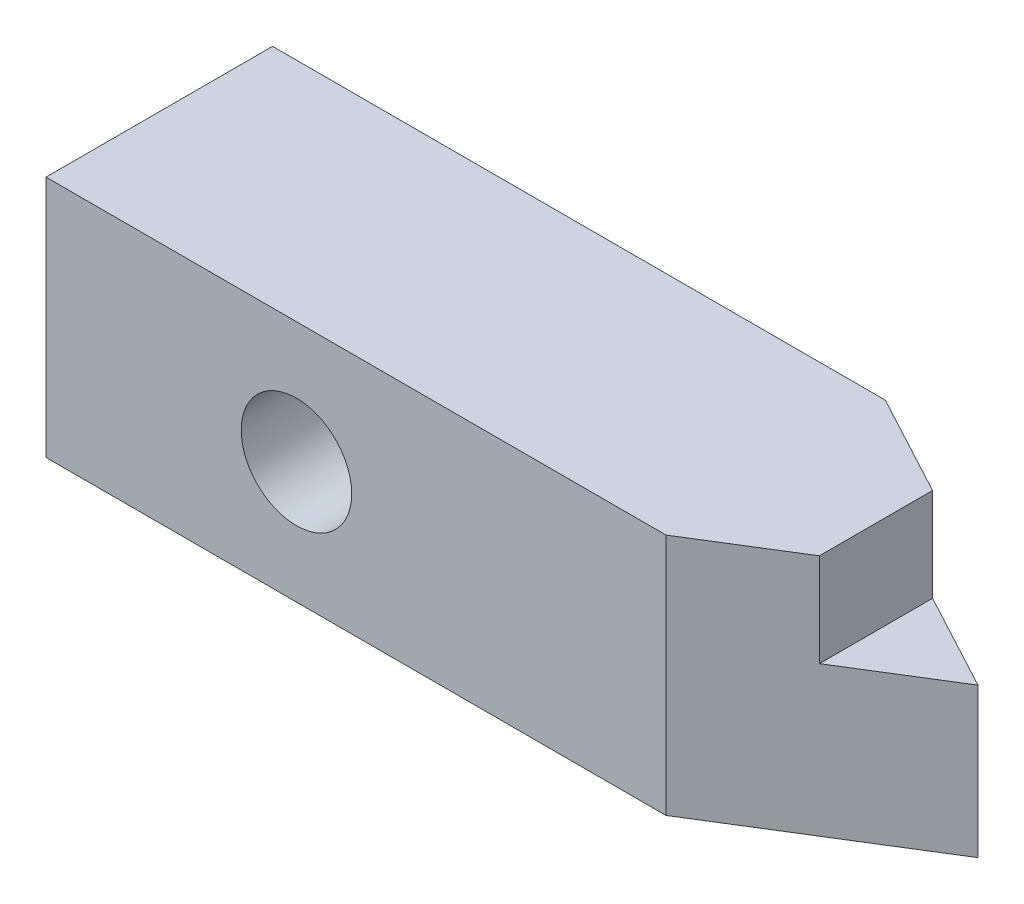
ISO-10303-21;
HEADER;
FILE_DESCRIPTION(('STEP AP214'),'2;1');
FILE_NAME('part.step','',(''),(''),'','','');
FILE_SCHEMA(('AUTOMOTIVE_DESIGN { 1 0 10303 214 1 1 1 1 }'));
ENDSEC;
DATA;
#1=APPLICATION_CONTEXT('core data for automotive mechanical design processes');
#2=APPLICATION_PROTOCOL_DEFINITION('international standard','automotive_design',2000,#1);
#3=PRODUCT_CONTEXT('',#1,'mechanical');
#4=PRODUCT('Part','Part','',(#3));
#5=PRODUCT_RELATED_PRODUCT_CATEGORY('part','',(#4));
#6=PRODUCT_DEFINITION_FORMATION('','',#4);
#7=PRODUCT_DEFINITION_CONTEXT('part definition',#1,'design');
#8=PRODUCT_DEFINITION('design','',#6,#7);
#9=PRODUCT_DEFINITION_SHAPE('','',#8);
#10=(LENGTH_UNIT() NAMED_UNIT(*) SI_UNIT(.MILLI.,.METRE.));
#11=(NAMED_UNIT(*) PLANE_ANGLE_UNIT() SI_UNIT($,.RADIAN.));
#12=(NAMED_UNIT(*) SI_UNIT($,.STERADIAN.) SOLID_ANGLE_UNIT());
#13=UNCERTAINTY_MEASURE_WITH_UNIT(LENGTH_MEASURE(1.E-05),#10,'distance_accuracy_value','');
#14=(GEOMETRIC_REPRESENTATION_CONTEXT(3) GLOBAL_UNCERTAINTY_ASSIGNED_CONTEXT((#13)) GLOBAL_UNIT_ASSIGNED_CONTEXT((#10,
#11,#12)) REPRESENTATION_CONTEXT('',''));
#15=CARTESIAN_POINT('',(0.,0.,0.));
#16=DIRECTION('',(0.,0.,1.));
#17=DIRECTION('',(1.,0.,0.));
#18=AXIS2_PLACEMENT_3D('',#15,#16,#17);
#19=CARTESIAN_POINT('',(36.2336343115124,26.,0.));
#20=DIRECTION('',(0.,0.,-1.));
#21=DIRECTION('',(-1.,0.,0.));
#22=AXIS2_PLACEMENT_3D('',#19,#20,#21);
#23=PLANE('',#22);
#24=CARTESIAN_POINT('',(-3.33144193961729,13.,0.));
#25=DIRECTION('',(0.,0.,1.));
#26=DIRECTION('',(1.,0.,0.));
#27=AXIS2_PLACEMENT_3D('',#24,#25,#26);
#28=CIRCLE('',#27,5.91574627108752);
#29=CARTESIAN_POINT('',(2.58430433147023,13.,0.));
#30=VERTEX_POINT('',#29);
#31=EDGE_CURVE('E110',#30,#30,#28,.T.);
#32=ORIENTED_EDGE('',*,*,#31,.F.);
#33=EDGE_LOOP('',(#32));
#34=FACE_BOUND('',#33,.T.);
#35=DIRECTION('',(1.,0.,0.));
#36=VECTOR('',#35,1.);
#37=CARTESIAN_POINT('',(36.2336343115124,0.,0.));
#38=LINE('',#37,#36);
#39=CARTESIAN_POINT('',(-30.1455981941309,0.,0.));
#40=VERTEX_POINT('',#39);
#41=CARTESIAN_POINT('',(36.2336343115124,0.,0.));
#42=VERTEX_POINT('',#41);
#43=EDGE_CURVE('E122',#40,#42,#38,.T.);
#44=ORIENTED_EDGE('',*,*,#43,.T.);
#45=DIRECTION('',(0.,-1.,0.));
#46=VECTOR('',#45,1.);
#47=CARTESIAN_POINT('',(36.2336343115124,26.,0.));
#48=LINE('',#47,#46);
#49=CARTESIAN_POINT('',(36.2336343115124,26.,0.));
#50=VERTEX_POINT('',#49);
#51=EDGE_CURVE('E149',#50,#42,#48,.T.);
#52=ORIENTED_EDGE('',*,*,#51,.F.);
#53=DIRECTION('',(1.,0.,0.));
#54=VECTOR('',#53,1.);
#55=CARTESIAN_POINT('',(36.2336343115124,26.,0.));
#56=LINE('',#55,#54);
#57=CARTESIAN_POINT('',(-30.1455981941309,26.,0.));
#58=VERTEX_POINT('',#57);
#59=EDGE_CURVE('E123',#58,#50,#56,.T.);
#60=ORIENTED_EDGE('',*,*,#59,.F.);
#61=DIRECTION('',(0.,-1.,0.));
#62=VECTOR('',#61,1.);
#63=CARTESIAN_POINT('',(-30.1455981941309,26.,0.));
#64=LINE('',#63,#62);
#65=EDGE_CURVE('E130',#58,#40,#64,.T.);
#66=ORIENTED_EDGE('',*,*,#65,.T.);
#67=EDGE_LOOP('',(#44,#52,#60,#66));
#68=FACE_BOUND('',#67,.T.);
#69=ADVANCED_FACE('F33',(#34,#68),#23,.F.);
#70=CARTESIAN_POINT('',(56.8544018058691,26.,-12.7897855530474));
#71=DIRECTION('',(-0.527085815509415,0.,-0.849812063393298));
#72=DIRECTION('',(-0.849812063393298,0.,0.527085815509415));
#73=AXIS2_PLACEMENT_3D('',#70,#71,#72);
#74=PLANE('',#73);
#75=DIRECTION('',(-0.849812063393298,0.,0.527085815509415));
#76=VECTOR('',#75,1.);
#77=CARTESIAN_POINT('',(56.8544018058691,16.,-12.7897855530474));
#78=LINE('',#77,#76);
#79=CARTESIAN_POINT('',(56.8544018058691,16.,-12.7897855530474));
#80=VERTEX_POINT('',#79);
#81=CARTESIAN_POINT('',(46.3729497466728,16.,-6.28878969252208));
#82=VERTEX_POINT('',#81);
#83=EDGE_CURVE('E105',#80,#82,#78,.T.);
#84=ORIENTED_EDGE('',*,*,#83,.T.);
#85=DIRECTION('',(0.,1.,0.));
#86=VECTOR('',#85,1.);
#87=CARTESIAN_POINT('',(46.3729497466728,26.,-6.28878969252207));
#88=LINE('',#87,#86);
#89=CARTESIAN_POINT('',(46.3729497466727,26.,-6.28878969252207));
#90=VERTEX_POINT('',#89);
#91=EDGE_CURVE('E109',#82,#90,#88,.T.);
#92=ORIENTED_EDGE('',*,*,#91,.T.);
#93=DIRECTION('',(0.849812063393298,0.,-0.527085815509415));
#94=VECTOR('',#93,1.);
#95=CARTESIAN_POINT('',(56.8544018058691,26.,-12.7897855530474));
#96=LINE('',#95,#94);
#97=EDGE_CURVE('E88',#50,#90,#96,.T.);
#98=ORIENTED_EDGE('',*,*,#97,.F.);
#99=ORIENTED_EDGE('',*,*,#51,.T.);
#100=DIRECTION('',(0.849812063393298,0.,-0.527085815509415));
#101=VECTOR('',#100,1.);
#102=CARTESIAN_POINT('',(56.8544018058691,0.,-12.7897855530474));
#103=LINE('',#102,#101);
#104=CARTESIAN_POINT('',(56.8544018058691,0.,-12.7897855530474));
#105=VERTEX_POINT('',#104);
#106=EDGE_CURVE('E133',#42,#105,#103,.T.);
#107=ORIENTED_EDGE('',*,*,#106,.T.);
#108=DIRECTION('',(0.,-1.,0.));
#109=VECTOR('',#108,1.);
#110=CARTESIAN_POINT('',(56.8544018058691,26.,-12.7897855530474));
#111=LINE('',#110,#109);
#112=EDGE_CURVE('E147',#80,#105,#111,.T.);
#113=ORIENTED_EDGE('',*,*,#112,.F.);
#114=EDGE_LOOP('',(#84,#92,#98,#99,#107,#113));
#115=FACE_BOUND('',#114,.T.);
#116=ADVANCED_FACE('F168',(#115),#74,.F.);
#117=CARTESIAN_POINT('',(35.4677388607964,26.,-24.2530012721688));
#118=DIRECTION('',(-0.472415927586356,0.,0.881375737902243));
#119=DIRECTION('',(0.881375737902243,0.,0.472415927586356));
#120=AXIS2_PLACEMENT_3D('',#117,#118,#119);
#121=PLANE('',#120);
#122=DIRECTION('',(-0.881375737902243,0.,-0.472415927586356));
#123=VECTOR('',#122,1.);
#124=CARTESIAN_POINT('',(35.4677388607964,26.,-24.2530012721688));
#125=LINE('',#124,#123);
#126=CARTESIAN_POINT('',(46.3729497466728,26.,-18.4078263999426));
#127=VERTEX_POINT('',#126);
#128=CARTESIAN_POINT('',(35.4677388607964,26.,-24.2530012721688));
#129=VERTEX_POINT('',#128);
#130=EDGE_CURVE('E115',#127,#129,#125,.T.);
#131=ORIENTED_EDGE('',*,*,#130,.F.);
#132=DIRECTION('',(0.,-1.,0.));
#133=VECTOR('',#132,1.);
#134=CARTESIAN_POINT('',(46.3729497466728,26.,-18.4078263999426));
#135=LINE('',#134,#133);
#136=CARTESIAN_POINT('',(46.3729497466728,16.,-18.4078263999426));
#137=VERTEX_POINT('',#136);
#138=EDGE_CURVE('E47',#127,#137,#135,.T.);
#139=ORIENTED_EDGE('',*,*,#138,.T.);
#140=DIRECTION('',(0.881375737902243,0.,0.472415927586356));
#141=VECTOR('',#140,1.);
#142=CARTESIAN_POINT('',(35.4677388607964,16.,-24.2530012721688));
#143=LINE('',#142,#141);
#144=EDGE_CURVE('E11',#137,#80,#143,.T.);
#145=ORIENTED_EDGE('',*,*,#144,.T.);
#146=ORIENTED_EDGE('',*,*,#112,.T.);
#147=DIRECTION('',(-0.881375737902243,0.,-0.472415927586356));
#148=VECTOR('',#147,1.);
#149=CARTESIAN_POINT('',(35.4677388607964,0.,-24.2530012721688));
#150=LINE('',#149,#148);
#151=CARTESIAN_POINT('',(35.4677388607964,0.,-24.2530012721688));
#152=VERTEX_POINT('',#151);
#153=EDGE_CURVE('E136',#105,#152,#150,.T.);
#154=ORIENTED_EDGE('',*,*,#153,.T.);
#155=DIRECTION('',(0.,-1.,0.));
#156=VECTOR('',#155,1.);
#157=CARTESIAN_POINT('',(35.4677388607964,26.,-24.2530012721688));
#158=LINE('',#157,#156);
#159=EDGE_CURVE('E144',#129,#152,#158,.T.);
#160=ORIENTED_EDGE('',*,*,#159,.F.);
#161=EDGE_LOOP('',(#131,#139,#145,#146,#154,#160));
#162=FACE_BOUND('',#161,.T.);
#163=ADVANCED_FACE('F113',(#162),#121,.F.);
#164=CARTESIAN_POINT('',(-30.1455981941309,26.,-24.2530012721689));
#165=DIRECTION('',(0.,0.,1.));
#166=DIRECTION('',(1.,0.,0.));
#167=AXIS2_PLACEMENT_3D('',#164,#165,#166);
#168=PLANE('',#167);
#169=CARTESIAN_POINT('',(-3.33144193961729,13.,-24.2530012721689));
#170=DIRECTION('',(0.,0.,1.));
#171=DIRECTION('',(1.,0.,0.));
#172=AXIS2_PLACEMENT_3D('',#169,#170,#171);
#173=CIRCLE('',#172,5.91574627108752);
#174=CARTESIAN_POINT('',(2.58430433147023,13.,-24.2530012721689));
#175=VERTEX_POINT('',#174);
#176=EDGE_CURVE('E117',#175,#175,#173,.T.);
#177=ORIENTED_EDGE('',*,*,#176,.T.);
#178=EDGE_LOOP('',(#177));
#179=FACE_BOUND('',#178,.T.);
#180=DIRECTION('',(-1.,0.,0.));
#181=VECTOR('',#180,1.);
#182=CARTESIAN_POINT('',(-30.1455981941309,0.,-24.2530012721689));
#183=LINE('',#182,#181);
#184=CARTESIAN_POINT('',(-30.1455981941309,0.,-24.2530012721689));
#185=VERTEX_POINT('',#184);
#186=EDGE_CURVE('E138',#152,#185,#183,.T.);
#187=ORIENTED_EDGE('',*,*,#186,.T.);
#188=DIRECTION('',(0.,-1.,0.));
#189=VECTOR('',#188,1.);
#190=CARTESIAN_POINT('',(-30.1455981941309,26.,-24.2530012721689));
#191=LINE('',#190,#189);
#192=CARTESIAN_POINT('',(-30.1455981941309,26.,-24.2530012721689));
#193=VERTEX_POINT('',#192);
#194=EDGE_CURVE('E142',#193,#185,#191,.T.);
#195=ORIENTED_EDGE('',*,*,#194,.F.);
#196=DIRECTION('',(-1.,0.,0.));
#197=VECTOR('',#196,1.);
#198=CARTESIAN_POINT('',(-30.1455981941309,26.,-24.2530012721689));
#199=LINE('',#198,#197);
#200=EDGE_CURVE('E127',#129,#193,#199,.T.);
#201=ORIENTED_EDGE('',*,*,#200,.F.);
#202=ORIENTED_EDGE('',*,*,#159,.T.);
#203=EDGE_LOOP('',(#187,#195,#201,#202));
#204=FACE_BOUND('',#203,.T.);
#205=ADVANCED_FACE('F154',(#179,#204),#168,.F.);
#206=CARTESIAN_POINT('',(-30.1455981941309,26.,0.));
#207=DIRECTION('',(1.,0.,0.));
#208=DIRECTION('',(0.,0.,-1.));
#209=AXIS2_PLACEMENT_3D('',#206,#207,#208);
#210=PLANE('',#209);
#211=DIRECTION('',(0.,0.,1.));
#212=VECTOR('',#211,1.);
#213=CARTESIAN_POINT('',(-30.1455981941309,0.,0.));
#214=LINE('',#213,#212);
#215=EDGE_CURVE('E80',#185,#40,#214,.T.);
#216=ORIENTED_EDGE('',*,*,#215,.T.);
#217=ORIENTED_EDGE('',*,*,#65,.F.);
#218=DIRECTION('',(0.,0.,1.));
#219=VECTOR('',#218,1.);
#220=CARTESIAN_POINT('',(-30.1455981941309,26.,0.));
#221=LINE('',#220,#219);
#222=EDGE_CURVE('E56',#193,#58,#221,.T.);
#223=ORIENTED_EDGE('',*,*,#222,.F.);
#224=ORIENTED_EDGE('',*,*,#194,.T.);
#225=EDGE_LOOP('',(#216,#217,#223,#224));
#226=FACE_BOUND('',#225,.T.);
#227=ADVANCED_FACE('F186',(#226),#210,.F.);
#228=CARTESIAN_POINT('',(0.,26.,0.));
#229=DIRECTION('',(0.,-1.,0.));
#230=DIRECTION('',(0.,0.,-1.));
#231=AXIS2_PLACEMENT_3D('',#228,#229,#230);
#232=PLANE('',#231);
#233=ORIENTED_EDGE('',*,*,#97,.T.);
#234=DIRECTION('',(0.,0.,-1.));
#235=VECTOR('',#234,1.);
#236=CARTESIAN_POINT('',(46.3729497466728,26.,0.));
#237=LINE('',#236,#235);
#238=EDGE_CURVE('E40',#90,#127,#237,.T.);
#239=ORIENTED_EDGE('',*,*,#238,.T.);
#240=ORIENTED_EDGE('',*,*,#130,.T.);
#241=ORIENTED_EDGE('',*,*,#200,.T.);
#242=ORIENTED_EDGE('',*,*,#222,.T.);
#243=ORIENTED_EDGE('',*,*,#59,.T.);
#244=EDGE_LOOP('',(#233,#239,#240,#241,#242,#243));
#245=FACE_BOUND('',#244,.T.);
#246=ADVANCED_FACE('F184',(#245),#232,.F.);
#247=CARTESIAN_POINT('',(0.,0.,0.));
#248=DIRECTION('',(0.,-1.,0.));
#249=DIRECTION('',(0.,0.,-1.));
#250=AXIS2_PLACEMENT_3D('',#247,#248,#249);
#251=PLANE('',#250);
#252=ORIENTED_EDGE('',*,*,#43,.F.);
#253=ORIENTED_EDGE('',*,*,#215,.F.);
#254=ORIENTED_EDGE('',*,*,#186,.F.);
#255=ORIENTED_EDGE('',*,*,#153,.F.);
#256=ORIENTED_EDGE('',*,*,#106,.F.);
#257=EDGE_LOOP('',(#252,#253,#254,#255,#256));
#258=FACE_BOUND('',#257,.T.);
#259=ADVANCED_FACE('F179',(#258),#251,.T.);
#260=CARTESIAN_POINT('',(46.3729497466728,16.,-46.));
#261=DIRECTION('',(0.,-1.,0.));
#262=DIRECTION('',(0.,0.,-1.));
#263=AXIS2_PLACEMENT_3D('',#260,#261,#262);
#264=PLANE('',#263);
#265=ORIENTED_EDGE('',*,*,#144,.F.);
#266=DIRECTION('',(0.,0.,1.));
#267=VECTOR('',#266,1.);
#268=CARTESIAN_POINT('',(46.3729497466728,16.,-46.));
#269=LINE('',#268,#267);
#270=EDGE_CURVE('E103',#137,#82,#269,.T.);
#271=ORIENTED_EDGE('',*,*,#270,.T.);
#272=ORIENTED_EDGE('',*,*,#83,.F.);
#273=EDGE_LOOP('',(#265,#271,#272));
#274=FACE_BOUND('',#273,.T.);
#275=ADVANCED_FACE('F102',(#274),#264,.F.);
#276=CARTESIAN_POINT('',(46.3729497466728,29.5958726815074,-46.));
#277=DIRECTION('',(-1.,0.,0.));
#278=DIRECTION('',(0.,-1.,0.));
#279=AXIS2_PLACEMENT_3D('',#276,#277,#278);
#280=PLANE('',#279);
#281=ORIENTED_EDGE('',*,*,#270,.F.);
#282=ORIENTED_EDGE('',*,*,#138,.F.);
#283=ORIENTED_EDGE('',*,*,#238,.F.);
#284=ORIENTED_EDGE('',*,*,#91,.F.);
#285=EDGE_LOOP('',(#281,#282,#283,#284));
#286=FACE_BOUND('',#285,.T.);
#287=ADVANCED_FACE('F108',(#286),#280,.F.);
#288=CARTESIAN_POINT('',(-3.33144193961729,13.,-46.));
#289=DIRECTION('',(0.,0.,1.));
#290=DIRECTION('',(1.,0.,0.));
#291=AXIS2_PLACEMENT_3D('',#288,#289,#290);
#292=CYLINDRICAL_SURFACE('',#291,5.91574627108752);
#293=ORIENTED_EDGE('',*,*,#31,.T.);
#294=EDGE_LOOP('',(#293));
#295=FACE_BOUND('',#294,.T.);
#296=ORIENTED_EDGE('',*,*,#176,.F.);
#297=EDGE_LOOP('',(#296));
#298=FACE_BOUND('',#297,.T.);
#299=ADVANCED_FACE('F157',(#295,#298),#292,.F.);
#300=CLOSED_SHELL('',(#69,#116,#163,#205,#227,#246,#259,#275,#287,#299));
#301=MANIFOLD_SOLID_BREP('B2',#300);
#302=ADVANCED_BREP_SHAPE_REPRESENTATION('',(#18,#301),#14);
#303=SHAPE_DEFINITION_REPRESENTATION(#9,#302);
ENDSEC;
END-ISO-10303-21;
